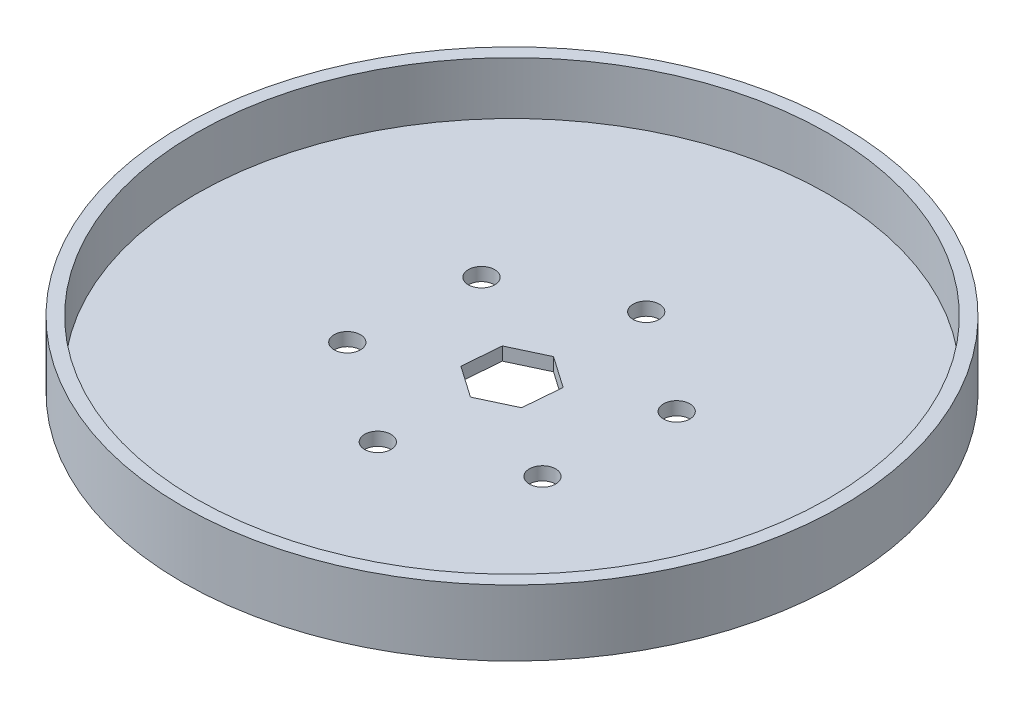
ISO-10303-21;
HEADER;
FILE_DESCRIPTION(('STEP AP214'),'2;1');
FILE_NAME('part.step','',(''),(''),'','','');
FILE_SCHEMA(('AUTOMOTIVE_DESIGN { 1 0 10303 214 1 1 1 1 }'));
ENDSEC;
DATA;
#1=APPLICATION_CONTEXT('core data for automotive mechanical design processes');
#2=APPLICATION_PROTOCOL_DEFINITION('international standard','automotive_design',2000,#1);
#3=PRODUCT_CONTEXT('',#1,'mechanical');
#4=PRODUCT('Part','Part','',(#3));
#5=PRODUCT_RELATED_PRODUCT_CATEGORY('part','',(#4));
#6=PRODUCT_DEFINITION_FORMATION('','',#4);
#7=PRODUCT_DEFINITION_CONTEXT('part definition',#1,'design');
#8=PRODUCT_DEFINITION('design','',#6,#7);
#9=PRODUCT_DEFINITION_SHAPE('','',#8);
#10=(LENGTH_UNIT() NAMED_UNIT(*) SI_UNIT(.MILLI.,.METRE.));
#11=(NAMED_UNIT(*) PLANE_ANGLE_UNIT() SI_UNIT($,.RADIAN.));
#12=(NAMED_UNIT(*) SI_UNIT($,.STERADIAN.) SOLID_ANGLE_UNIT());
#13=UNCERTAINTY_MEASURE_WITH_UNIT(LENGTH_MEASURE(1.E-05),#10,'distance_accuracy_value','');
#14=(GEOMETRIC_REPRESENTATION_CONTEXT(3) GLOBAL_UNCERTAINTY_ASSIGNED_CONTEXT((#13)) GLOBAL_UNIT_ASSIGNED_CONTEXT((#10,
#11,#12)) REPRESENTATION_CONTEXT('',''));
#15=CARTESIAN_POINT('',(0.,0.,0.));
#16=DIRECTION('',(0.,0.,1.));
#17=DIRECTION('',(1.,0.,0.));
#18=AXIS2_PLACEMENT_3D('',#15,#16,#17);
#19=CARTESIAN_POINT('',(0.,-12.7,0.));
#20=DIRECTION('',(0.,1.,0.));
#21=DIRECTION('',(0.,0.,1.));
#22=AXIS2_PLACEMENT_3D('',#19,#20,#21);
#23=CYLINDRICAL_SURFACE('',#22,63.5);
#24=CARTESIAN_POINT('',(0.,-12.7,0.));
#25=DIRECTION('',(0.,1.,0.));
#26=DIRECTION('',(0.,0.,1.));
#27=AXIS2_PLACEMENT_3D('',#24,#25,#26);
#28=CIRCLE('',#27,63.5);
#29=CARTESIAN_POINT('',(0.,-12.7,63.5));
#30=VERTEX_POINT('',#29);
#31=EDGE_CURVE('E11',#30,#30,#28,.T.);
#32=ORIENTED_EDGE('',*,*,#31,.T.);
#33=EDGE_LOOP('',(#32));
#34=FACE_BOUND('',#33,.T.);
#35=CARTESIAN_POINT('',(0.,0.,0.));
#36=DIRECTION('',(0.,1.,0.));
#37=DIRECTION('',(0.,0.,1.));
#38=AXIS2_PLACEMENT_3D('',#35,#36,#37);
#39=CIRCLE('',#38,63.5);
#40=CARTESIAN_POINT('',(0.,0.,63.5));
#41=VERTEX_POINT('',#40);
#42=EDGE_CURVE('E42',#41,#41,#39,.T.);
#43=ORIENTED_EDGE('',*,*,#42,.F.);
#44=EDGE_LOOP('',(#43));
#45=FACE_BOUND('',#44,.T.);
#46=ADVANCED_FACE('F39',(#34,#45),#23,.T.);
#47=CARTESIAN_POINT('',(0.,-12.7,0.));
#48=DIRECTION('',(0.,1.,0.));
#49=DIRECTION('',(0.,0.,1.));
#50=AXIS2_PLACEMENT_3D('',#47,#48,#49);
#51=PLANE('',#50);
#52=DIRECTION('',(-0.905001604638414,0.,0.4254081517812));
#53=VECTOR('',#52,1.);
#54=CARTESIAN_POINT('',(0.622717296324225,-12.7,-7.3794443898028));
#55=LINE('',#54,#53);
#56=CARTESIAN_POINT('',(0.622717296324225,-12.7,-7.3794443898028));
#57=VERTEX_POINT('',#56);
#58=CARTESIAN_POINT('',(-6.07942765922167,-12.7,-4.22901119289414));
#59=VERTEX_POINT('',#58);
#60=EDGE_CURVE('E117',#57,#59,#55,.T.);
#61=ORIENTED_EDGE('',*,*,#60,.T.);
#62=DIRECTION('',(-0.0840865358997016,0.,0.996458455973147));
#63=VECTOR('',#62,1.);
#64=CARTESIAN_POINT('',(-6.07942765922167,-12.7,-4.22901119289414));
#65=LINE('',#64,#63);
#66=CARTESIAN_POINT('',(-6.70214495554589,-12.7,3.15043319690866));
#67=VERTEX_POINT('',#66);
#68=EDGE_CURVE('E248',#59,#67,#65,.T.);
#69=ORIENTED_EDGE('',*,*,#68,.T.);
#70=DIRECTION('',(0.820915068738712,0.,0.571050304191948));
#71=VECTOR('',#70,1.);
#72=CARTESIAN_POINT('',(-6.70214495554589,-12.7,3.15043319690866));
#73=LINE('',#72,#71);
#74=CARTESIAN_POINT('',(-0.622717296324223,-12.7,7.3794443898028));
#75=VERTEX_POINT('',#74);
#76=EDGE_CURVE('E284',#67,#75,#73,.T.);
#77=ORIENTED_EDGE('',*,*,#76,.T.);
#78=DIRECTION('',(0.905001604638414,0.,-0.4254081517812));
#79=VECTOR('',#78,1.);
#80=CARTESIAN_POINT('',(-0.622717296324223,-12.7,7.3794443898028));
#81=LINE('',#80,#79);
#82=CARTESIAN_POINT('',(6.07942765922167,-12.7,4.22901119289414));
#83=VERTEX_POINT('',#82);
#84=EDGE_CURVE('E62',#75,#83,#81,.T.);
#85=ORIENTED_EDGE('',*,*,#84,.T.);
#86=DIRECTION('',(0.0840865358997015,0.,-0.996458455973147));
#87=VECTOR('',#86,1.);
#88=CARTESIAN_POINT('',(6.07942765922167,-12.7,4.22901119289414));
#89=LINE('',#88,#87);
#90=CARTESIAN_POINT('',(6.70214495554589,-12.7,-3.15043319690866));
#91=VERTEX_POINT('',#90);
#92=EDGE_CURVE('E290',#83,#91,#89,.T.);
#93=ORIENTED_EDGE('',*,*,#92,.T.);
#94=DIRECTION('',(-0.820915068738712,0.,-0.571050304191948));
#95=VECTOR('',#94,1.);
#96=CARTESIAN_POINT('',(6.70214495554589,-12.7,-3.15043319690866));
#97=LINE('',#96,#95);
#98=EDGE_CURVE('E294',#91,#57,#97,.T.);
#99=ORIENTED_EDGE('',*,*,#98,.T.);
#100=EDGE_LOOP('',(#61,#69,#77,#85,#93,#99));
#101=FACE_BOUND('',#100,.T.);
#102=CARTESIAN_POINT('',(-2.0723522882915,-12.7,23.7858935504474));
#103=DIRECTION('',(0.,1.,0.));
#104=DIRECTION('',(0.,0.,1.));
#105=AXIS2_PLACEMENT_3D('',#102,#103,#104);
#106=CIRCLE('',#105,2.54);
#107=CARTESIAN_POINT('',(-2.0723522882915,-12.7,26.3258935504474));
#108=VERTEX_POINT('',#107);
#109=EDGE_CURVE('E124',#108,#108,#106,.T.);
#110=ORIENTED_EDGE('',*,*,#109,.T.);
#111=EDGE_LOOP('',(#110));
#112=FACE_BOUND('',#111,.T.);
#113=CARTESIAN_POINT('',(19.5630119222539,-12.7,13.6876565024752));
#114=DIRECTION('',(0.,1.,0.));
#115=DIRECTION('',(0.,0.,1.));
#116=AXIS2_PLACEMENT_3D('',#113,#114,#115);
#117=CIRCLE('',#116,2.54000000000001);
#118=CARTESIAN_POINT('',(19.5630119222539,-12.7,16.2276565024752));
#119=VERTEX_POINT('',#118);
#120=EDGE_CURVE('E153',#119,#119,#117,.T.);
#121=ORIENTED_EDGE('',*,*,#120,.T.);
#122=EDGE_LOOP('',(#121));
#123=FACE_BOUND('',#122,.T.);
#124=CARTESIAN_POINT('',(-21.6353642105456,-12.7,10.0982370479724));
#125=DIRECTION('',(0.,1.,0.));
#126=DIRECTION('',(0.,0.,1.));
#127=AXIS2_PLACEMENT_3D('',#124,#125,#126);
#128=CIRCLE('',#127,2.54000000000001);
#129=CARTESIAN_POINT('',(-21.6353642105456,-12.7,12.6382370479724));
#130=VERTEX_POINT('',#129);
#131=EDGE_CURVE('E149',#130,#130,#128,.T.);
#132=ORIENTED_EDGE('',*,*,#131,.T.);
#133=EDGE_LOOP('',(#132));
#134=FACE_BOUND('',#133,.T.);
#135=CARTESIAN_POINT('',(-19.563011922254,-12.7,-13.687656502475));
#136=DIRECTION('',(0.,1.,0.));
#137=DIRECTION('',(0.,0.,1.));
#138=AXIS2_PLACEMENT_3D('',#135,#136,#137);
#139=CIRCLE('',#138,2.54);
#140=CARTESIAN_POINT('',(-19.563011922254,-12.7,-11.147656502475));
#141=VERTEX_POINT('',#140);
#142=EDGE_CURVE('E145',#141,#141,#139,.T.);
#143=ORIENTED_EDGE('',*,*,#142,.T.);
#144=EDGE_LOOP('',(#143));
#145=FACE_BOUND('',#144,.T.);
#146=CARTESIAN_POINT('',(2.07235228829167,-12.7,-23.7858935504473));
#147=DIRECTION('',(0.,1.,0.));
#148=DIRECTION('',(0.,0.,1.));
#149=AXIS2_PLACEMENT_3D('',#146,#147,#148);
#150=CIRCLE('',#149,2.54000000000001);
#151=CARTESIAN_POINT('',(2.07235228829167,-12.7,-21.2458935504473));
#152=VERTEX_POINT('',#151);
#153=EDGE_CURVE('E140',#152,#152,#150,.T.);
#154=ORIENTED_EDGE('',*,*,#153,.T.);
#155=EDGE_LOOP('',(#154));
#156=FACE_BOUND('',#155,.T.);
#157=CARTESIAN_POINT('',(21.6353642105457,-12.7,-10.0982370479722));
#158=DIRECTION('',(0.,1.,0.));
#159=DIRECTION('',(0.,0.,1.));
#160=AXIS2_PLACEMENT_3D('',#157,#158,#159);
#161=CIRCLE('',#160,2.54000000000001);
#162=CARTESIAN_POINT('',(21.6353642105457,-12.7,-7.55823704797221));
#163=VERTEX_POINT('',#162);
#164=EDGE_CURVE('E144',#163,#163,#161,.T.);
#165=ORIENTED_EDGE('',*,*,#164,.T.);
#166=EDGE_LOOP('',(#165));
#167=FACE_BOUND('',#166,.T.);
#168=ORIENTED_EDGE('',*,*,#31,.F.);
#169=EDGE_LOOP('',(#168));
#170=FACE_BOUND('',#169,.T.);
#171=ADVANCED_FACE('F171',(#101,#112,#123,#134,#145,#156,#167,#170),#51,.F.);
#172=CARTESIAN_POINT('',(0.,0.,0.));
#173=DIRECTION('',(0.,1.,0.));
#174=DIRECTION('',(0.,0.,1.));
#175=AXIS2_PLACEMENT_3D('',#172,#173,#174);
#176=PLANE('',#175);
#177=CARTESIAN_POINT('',(0.,0.,0.));
#178=DIRECTION('',(0.,1.,0.));
#179=DIRECTION('',(0.,0.,1.));
#180=AXIS2_PLACEMENT_3D('',#177,#178,#179);
#181=CIRCLE('',#180,60.96);
#182=CARTESIAN_POINT('',(0.,0.,60.96));
#183=VERTEX_POINT('',#182);
#184=EDGE_CURVE('E242',#183,#183,#181,.T.);
#185=ORIENTED_EDGE('',*,*,#184,.F.);
#186=EDGE_LOOP('',(#185));
#187=FACE_BOUND('',#186,.T.);
#188=ORIENTED_EDGE('',*,*,#42,.T.);
#189=EDGE_LOOP('',(#188));
#190=FACE_BOUND('',#189,.T.);
#191=ADVANCED_FACE('F168',(#187,#190),#176,.T.);
#192=CARTESIAN_POINT('',(21.6353642105457,-12.7,-10.0982370479722));
#193=DIRECTION('',(0.,1.,0.));
#194=DIRECTION('',(0.,0.,1.));
#195=AXIS2_PLACEMENT_3D('',#192,#193,#194);
#196=CYLINDRICAL_SURFACE('',#195,2.54000000000001);
#197=CARTESIAN_POINT('',(21.6353642105457,-10.16,-10.0982370479722));
#198=DIRECTION('',(0.,1.,0.));
#199=DIRECTION('',(0.,0.,1.));
#200=AXIS2_PLACEMENT_3D('',#197,#198,#199);
#201=CIRCLE('',#200,2.54000000000001);
#202=CARTESIAN_POINT('',(21.6353642105457,-10.16,-7.55823704797221));
#203=VERTEX_POINT('',#202);
#204=EDGE_CURVE('E244',#203,#203,#201,.T.);
#205=ORIENTED_EDGE('',*,*,#204,.T.);
#206=EDGE_LOOP('',(#205));
#207=FACE_BOUND('',#206,.T.);
#208=ORIENTED_EDGE('',*,*,#164,.F.);
#209=EDGE_LOOP('',(#208));
#210=FACE_BOUND('',#209,.T.);
#211=ADVANCED_FACE('F183',(#207,#210),#196,.F.);
#212=CARTESIAN_POINT('',(2.07235228829167,-12.7,-23.7858935504473));
#213=DIRECTION('',(0.,1.,0.));
#214=DIRECTION('',(0.,0.,1.));
#215=AXIS2_PLACEMENT_3D('',#212,#213,#214);
#216=CYLINDRICAL_SURFACE('',#215,2.54000000000001);
#217=CARTESIAN_POINT('',(2.07235228829167,-10.16,-23.7858935504473));
#218=DIRECTION('',(0.,1.,0.));
#219=DIRECTION('',(0.,0.,1.));
#220=AXIS2_PLACEMENT_3D('',#217,#218,#219);
#221=CIRCLE('',#220,2.54000000000001);
#222=CARTESIAN_POINT('',(2.07235228829167,-10.16,-21.2458935504473));
#223=VERTEX_POINT('',#222);
#224=EDGE_CURVE('E251',#223,#223,#221,.T.);
#225=ORIENTED_EDGE('',*,*,#224,.T.);
#226=EDGE_LOOP('',(#225));
#227=FACE_BOUND('',#226,.T.);
#228=ORIENTED_EDGE('',*,*,#153,.F.);
#229=EDGE_LOOP('',(#228));
#230=FACE_BOUND('',#229,.T.);
#231=ADVANCED_FACE('F189',(#227,#230),#216,.F.);
#232=CARTESIAN_POINT('',(-19.563011922254,-12.7,-13.687656502475));
#233=DIRECTION('',(0.,1.,0.));
#234=DIRECTION('',(0.,0.,1.));
#235=AXIS2_PLACEMENT_3D('',#232,#233,#234);
#236=CYLINDRICAL_SURFACE('',#235,2.54);
#237=CARTESIAN_POINT('',(-19.563011922254,-10.16,-13.687656502475));
#238=DIRECTION('',(0.,1.,0.));
#239=DIRECTION('',(0.,0.,1.));
#240=AXIS2_PLACEMENT_3D('',#237,#238,#239);
#241=CIRCLE('',#240,2.54);
#242=CARTESIAN_POINT('',(-19.563011922254,-10.16,-11.147656502475));
#243=VERTEX_POINT('',#242);
#244=EDGE_CURVE('E274',#243,#243,#241,.T.);
#245=ORIENTED_EDGE('',*,*,#244,.T.);
#246=EDGE_LOOP('',(#245));
#247=FACE_BOUND('',#246,.T.);
#248=ORIENTED_EDGE('',*,*,#142,.F.);
#249=EDGE_LOOP('',(#248));
#250=FACE_BOUND('',#249,.T.);
#251=ADVANCED_FACE('F203',(#247,#250),#236,.F.);
#252=CARTESIAN_POINT('',(-21.6353642105456,-12.7,10.0982370479724));
#253=DIRECTION('',(0.,1.,0.));
#254=DIRECTION('',(0.,0.,1.));
#255=AXIS2_PLACEMENT_3D('',#252,#253,#254);
#256=CYLINDRICAL_SURFACE('',#255,2.54000000000001);
#257=CARTESIAN_POINT('',(-21.6353642105456,-10.16,10.0982370479724));
#258=DIRECTION('',(0.,1.,0.));
#259=DIRECTION('',(0.,0.,1.));
#260=AXIS2_PLACEMENT_3D('',#257,#258,#259);
#261=CIRCLE('',#260,2.54000000000001);
#262=CARTESIAN_POINT('',(-21.6353642105456,-10.16,12.6382370479724));
#263=VERTEX_POINT('',#262);
#264=EDGE_CURVE('E270',#263,#263,#261,.T.);
#265=ORIENTED_EDGE('',*,*,#264,.T.);
#266=EDGE_LOOP('',(#265));
#267=FACE_BOUND('',#266,.T.);
#268=ORIENTED_EDGE('',*,*,#131,.F.);
#269=EDGE_LOOP('',(#268));
#270=FACE_BOUND('',#269,.T.);
#271=ADVANCED_FACE('F199',(#267,#270),#256,.F.);
#272=CARTESIAN_POINT('',(19.5630119222539,-12.7,13.6876565024752));
#273=DIRECTION('',(0.,1.,0.));
#274=DIRECTION('',(0.,0.,1.));
#275=AXIS2_PLACEMENT_3D('',#272,#273,#274);
#276=CYLINDRICAL_SURFACE('',#275,2.54000000000001);
#277=CARTESIAN_POINT('',(19.5630119222539,-10.16,13.6876565024752));
#278=DIRECTION('',(0.,1.,0.));
#279=DIRECTION('',(0.,0.,1.));
#280=AXIS2_PLACEMENT_3D('',#277,#278,#279);
#281=CIRCLE('',#280,2.54000000000001);
#282=CARTESIAN_POINT('',(19.5630119222539,-10.16,16.2276565024752));
#283=VERTEX_POINT('',#282);
#284=EDGE_CURVE('E266',#283,#283,#281,.T.);
#285=ORIENTED_EDGE('',*,*,#284,.T.);
#286=EDGE_LOOP('',(#285));
#287=FACE_BOUND('',#286,.T.);
#288=ORIENTED_EDGE('',*,*,#120,.F.);
#289=EDGE_LOOP('',(#288));
#290=FACE_BOUND('',#289,.T.);
#291=ADVANCED_FACE('F195',(#287,#290),#276,.F.);
#292=CARTESIAN_POINT('',(-2.0723522882915,-12.7,23.7858935504474));
#293=DIRECTION('',(0.,1.,0.));
#294=DIRECTION('',(0.,0.,1.));
#295=AXIS2_PLACEMENT_3D('',#292,#293,#294);
#296=CYLINDRICAL_SURFACE('',#295,2.54);
#297=CARTESIAN_POINT('',(-2.0723522882915,-10.16,23.7858935504474));
#298=DIRECTION('',(0.,1.,0.));
#299=DIRECTION('',(0.,0.,1.));
#300=AXIS2_PLACEMENT_3D('',#297,#298,#299);
#301=CIRCLE('',#300,2.54);
#302=CARTESIAN_POINT('',(-2.0723522882915,-10.16,26.3258935504474));
#303=VERTEX_POINT('',#302);
#304=EDGE_CURVE('E103',#303,#303,#301,.T.);
#305=ORIENTED_EDGE('',*,*,#304,.T.);
#306=EDGE_LOOP('',(#305));
#307=FACE_BOUND('',#306,.T.);
#308=ORIENTED_EDGE('',*,*,#109,.F.);
#309=EDGE_LOOP('',(#308));
#310=FACE_BOUND('',#309,.T.);
#311=ADVANCED_FACE('F191',(#307,#310),#296,.F.);
#312=CARTESIAN_POINT('',(-6.07942765922167,-12.7,-4.22901119289414));
#313=DIRECTION('',(-0.996458455973147,0.,-0.0840865358997016));
#314=DIRECTION('',(-0.0840865358997017,0.,0.996458455973147));
#315=AXIS2_PLACEMENT_3D('',#312,#313,#314);
#316=PLANE('',#315);
#317=DIRECTION('',(0.,1.,0.));
#318=VECTOR('',#317,1.);
#319=CARTESIAN_POINT('',(-6.07942765922167,-12.7,-4.22901119289414));
#320=LINE('',#319,#318);
#321=CARTESIAN_POINT('',(-6.07942765922167,-10.16,-4.22901119289414));
#322=VERTEX_POINT('',#321);
#323=EDGE_CURVE('E120',#59,#322,#320,.T.);
#324=ORIENTED_EDGE('',*,*,#323,.T.);
#325=DIRECTION('',(-0.0840865358997017,0.,0.996458455973147));
#326=VECTOR('',#325,1.);
#327=CARTESIAN_POINT('',(-6.39078630738378,-10.16,-0.539288997992736));
#328=LINE('',#327,#326);
#329=CARTESIAN_POINT('',(-6.70214495554589,-10.16,3.15043319690866));
#330=VERTEX_POINT('',#329);
#331=EDGE_CURVE('E98',#322,#330,#328,.T.);
#332=ORIENTED_EDGE('',*,*,#331,.T.);
#333=DIRECTION('',(0.,1.,0.));
#334=VECTOR('',#333,1.);
#335=CARTESIAN_POINT('',(-6.70214495554589,-12.7,3.15043319690866));
#336=LINE('',#335,#334);
#337=EDGE_CURVE('E136',#67,#330,#336,.T.);
#338=ORIENTED_EDGE('',*,*,#337,.F.);
#339=ORIENTED_EDGE('',*,*,#68,.F.);
#340=EDGE_LOOP('',(#324,#332,#338,#339));
#341=FACE_BOUND('',#340,.T.);
#342=ADVANCED_FACE('F194',(#341),#316,.F.);
#343=CARTESIAN_POINT('',(0.622717296324225,-12.7,-7.3794443898028));
#344=DIRECTION('',(-0.4254081517812,0.,-0.905001604638414));
#345=DIRECTION('',(-0.905001604638414,0.,0.4254081517812));
#346=AXIS2_PLACEMENT_3D('',#343,#344,#345);
#347=PLANE('',#346);
#348=DIRECTION('',(0.,1.,0.));
#349=VECTOR('',#348,1.);
#350=CARTESIAN_POINT('',(0.622717296324225,-12.7,-7.3794443898028));
#351=LINE('',#350,#349);
#352=CARTESIAN_POINT('',(0.622717296324225,-10.16,-7.3794443898028));
#353=VERTEX_POINT('',#352);
#354=EDGE_CURVE('E109',#57,#353,#351,.T.);
#355=ORIENTED_EDGE('',*,*,#354,.T.);
#356=DIRECTION('',(-0.905001604638414,0.,0.4254081517812));
#357=VECTOR('',#356,1.);
#358=CARTESIAN_POINT('',(-2.72835518144872,-10.16,-5.80422779134847));
#359=LINE('',#358,#357);
#360=EDGE_CURVE('E91',#353,#322,#359,.T.);
#361=ORIENTED_EDGE('',*,*,#360,.T.);
#362=ORIENTED_EDGE('',*,*,#323,.F.);
#363=ORIENTED_EDGE('',*,*,#60,.F.);
#364=EDGE_LOOP('',(#355,#361,#362,#363));
#365=FACE_BOUND('',#364,.T.);
#366=ADVANCED_FACE('F115',(#365),#347,.F.);
#367=CARTESIAN_POINT('',(6.70214495554589,-12.7,-3.15043319690866));
#368=DIRECTION('',(0.571050304191948,0.,-0.820915068738712));
#369=DIRECTION('',(-0.820915068738712,0.,-0.571050304191948));
#370=AXIS2_PLACEMENT_3D('',#367,#368,#369);
#371=PLANE('',#370);
#372=DIRECTION('',(0.,1.,0.));
#373=VECTOR('',#372,1.);
#374=CARTESIAN_POINT('',(6.70214495554589,-12.7,-3.15043319690866));
#375=LINE('',#374,#373);
#376=CARTESIAN_POINT('',(6.70214495554589,-10.16,-3.15043319690866));
#377=VERTEX_POINT('',#376);
#378=EDGE_CURVE('E111',#91,#377,#375,.T.);
#379=ORIENTED_EDGE('',*,*,#378,.T.);
#380=DIRECTION('',(-0.820915068738712,0.,-0.571050304191948));
#381=VECTOR('',#380,1.);
#382=CARTESIAN_POINT('',(3.66243112593506,-10.16,-5.26493879335573));
#383=LINE('',#382,#381);
#384=EDGE_CURVE('E95',#377,#353,#383,.T.);
#385=ORIENTED_EDGE('',*,*,#384,.T.);
#386=ORIENTED_EDGE('',*,*,#354,.F.);
#387=ORIENTED_EDGE('',*,*,#98,.F.);
#388=EDGE_LOOP('',(#379,#385,#386,#387));
#389=FACE_BOUND('',#388,.T.);
#390=ADVANCED_FACE('F107',(#389),#371,.F.);
#391=CARTESIAN_POINT('',(6.07942765922167,-12.7,4.22901119289414));
#392=DIRECTION('',(0.996458455973147,0.,0.0840865358997015));
#393=DIRECTION('',(0.0840865358997015,0.,-0.996458455973147));
#394=AXIS2_PLACEMENT_3D('',#391,#392,#393);
#395=PLANE('',#394);
#396=DIRECTION('',(0.,1.,0.));
#397=VECTOR('',#396,1.);
#398=CARTESIAN_POINT('',(6.07942765922167,-12.7,4.22901119289414));
#399=LINE('',#398,#397);
#400=CARTESIAN_POINT('',(6.07942765922167,-10.16,4.22901119289414));
#401=VERTEX_POINT('',#400);
#402=EDGE_CURVE('E126',#83,#401,#399,.T.);
#403=ORIENTED_EDGE('',*,*,#402,.T.);
#404=DIRECTION('',(0.0840865358997015,0.,-0.996458455973147));
#405=VECTOR('',#404,1.);
#406=CARTESIAN_POINT('',(6.39078630738378,-10.16,0.539288997992735));
#407=LINE('',#406,#405);
#408=EDGE_CURVE('E113',#401,#377,#407,.T.);
#409=ORIENTED_EDGE('',*,*,#408,.T.);
#410=ORIENTED_EDGE('',*,*,#378,.F.);
#411=ORIENTED_EDGE('',*,*,#92,.F.);
#412=EDGE_LOOP('',(#403,#409,#410,#411));
#413=FACE_BOUND('',#412,.T.);
#414=ADVANCED_FACE('F222',(#413),#395,.F.);
#415=CARTESIAN_POINT('',(-0.622717296324223,-12.7,7.3794443898028));
#416=DIRECTION('',(0.4254081517812,0.,0.905001604638414));
#417=DIRECTION('',(0.905001604638414,0.,-0.4254081517812));
#418=AXIS2_PLACEMENT_3D('',#415,#416,#417);
#419=PLANE('',#418);
#420=DIRECTION('',(0.,1.,0.));
#421=VECTOR('',#420,1.);
#422=CARTESIAN_POINT('',(-0.622717296324223,-12.7,7.3794443898028));
#423=LINE('',#422,#421);
#424=CARTESIAN_POINT('',(-0.622717296324223,-10.16,7.3794443898028));
#425=VERTEX_POINT('',#424);
#426=EDGE_CURVE('E133',#75,#425,#423,.T.);
#427=ORIENTED_EDGE('',*,*,#426,.T.);
#428=DIRECTION('',(0.905001604638414,0.,-0.4254081517812));
#429=VECTOR('',#428,1.);
#430=CARTESIAN_POINT('',(2.72835518144872,-10.16,5.80422779134847));
#431=LINE('',#430,#429);
#432=EDGE_CURVE('E54',#425,#401,#431,.T.);
#433=ORIENTED_EDGE('',*,*,#432,.T.);
#434=ORIENTED_EDGE('',*,*,#402,.F.);
#435=ORIENTED_EDGE('',*,*,#84,.F.);
#436=EDGE_LOOP('',(#427,#433,#434,#435));
#437=FACE_BOUND('',#436,.T.);
#438=ADVANCED_FACE('F218',(#437),#419,.F.);
#439=CARTESIAN_POINT('',(-6.70214495554589,-12.7,3.15043319690866));
#440=DIRECTION('',(-0.571050304191948,0.,0.820915068738712));
#441=DIRECTION('',(0.820915068738712,0.,0.571050304191948));
#442=AXIS2_PLACEMENT_3D('',#439,#440,#441);
#443=PLANE('',#442);
#444=ORIENTED_EDGE('',*,*,#337,.T.);
#445=DIRECTION('',(0.820915068738712,0.,0.571050304191948));
#446=VECTOR('',#445,1.);
#447=CARTESIAN_POINT('',(-3.66243112593506,-10.16,5.26493879335573));
#448=LINE('',#447,#446);
#449=EDGE_CURVE('E258',#330,#425,#448,.T.);
#450=ORIENTED_EDGE('',*,*,#449,.T.);
#451=ORIENTED_EDGE('',*,*,#426,.F.);
#452=ORIENTED_EDGE('',*,*,#76,.F.);
#453=EDGE_LOOP('',(#444,#450,#451,#452));
#454=FACE_BOUND('',#453,.T.);
#455=ADVANCED_FACE('F214',(#454),#443,.F.);
#456=CARTESIAN_POINT('',(0.,-12.7,0.));
#457=DIRECTION('',(0.,1.,0.));
#458=DIRECTION('',(0.,0.,1.));
#459=AXIS2_PLACEMENT_3D('',#456,#457,#458);
#460=CYLINDRICAL_SURFACE('',#459,60.96);
#461=CARTESIAN_POINT('',(0.,-10.16,0.));
#462=DIRECTION('',(0.,1.,0.));
#463=DIRECTION('',(0.,0.,1.));
#464=AXIS2_PLACEMENT_3D('',#461,#462,#463);
#465=CIRCLE('',#464,60.96);
#466=CARTESIAN_POINT('',(0.,-10.16,60.96));
#467=VERTEX_POINT('',#466);
#468=EDGE_CURVE('E239',#467,#467,#465,.T.);
#469=ORIENTED_EDGE('',*,*,#468,.F.);
#470=EDGE_LOOP('',(#469));
#471=FACE_BOUND('',#470,.T.);
#472=ORIENTED_EDGE('',*,*,#184,.T.);
#473=EDGE_LOOP('',(#472));
#474=FACE_BOUND('',#473,.T.);
#475=ADVANCED_FACE('F217',(#471,#474),#460,.F.);
#476=CARTESIAN_POINT('',(0.,-10.16,0.));
#477=DIRECTION('',(0.,1.,0.));
#478=DIRECTION('',(0.,0.,1.));
#479=AXIS2_PLACEMENT_3D('',#476,#477,#478);
#480=PLANE('',#479);
#481=ORIENTED_EDGE('',*,*,#360,.F.);
#482=ORIENTED_EDGE('',*,*,#384,.F.);
#483=ORIENTED_EDGE('',*,*,#408,.F.);
#484=ORIENTED_EDGE('',*,*,#432,.F.);
#485=ORIENTED_EDGE('',*,*,#449,.F.);
#486=ORIENTED_EDGE('',*,*,#331,.F.);
#487=EDGE_LOOP('',(#481,#482,#483,#484,#485,#486));
#488=FACE_BOUND('',#487,.T.);
#489=ORIENTED_EDGE('',*,*,#304,.F.);
#490=EDGE_LOOP('',(#489));
#491=FACE_BOUND('',#490,.T.);
#492=ORIENTED_EDGE('',*,*,#284,.F.);
#493=EDGE_LOOP('',(#492));
#494=FACE_BOUND('',#493,.T.);
#495=ORIENTED_EDGE('',*,*,#264,.F.);
#496=EDGE_LOOP('',(#495));
#497=FACE_BOUND('',#496,.T.);
#498=ORIENTED_EDGE('',*,*,#244,.F.);
#499=EDGE_LOOP('',(#498));
#500=FACE_BOUND('',#499,.T.);
#501=ORIENTED_EDGE('',*,*,#224,.F.);
#502=EDGE_LOOP('',(#501));
#503=FACE_BOUND('',#502,.T.);
#504=ORIENTED_EDGE('',*,*,#204,.F.);
#505=EDGE_LOOP('',(#504));
#506=FACE_BOUND('',#505,.T.);
#507=ORIENTED_EDGE('',*,*,#468,.T.);
#508=EDGE_LOOP('',(#507));
#509=FACE_BOUND('',#508,.T.);
#510=ADVANCED_FACE('F93',(#488,#491,#494,#497,#500,#503,#506,#509),#480,.T.);
#511=CLOSED_SHELL('',(#46,#171,#191,#211,#231,#251,#271,#291,#311,#342,#366,#390,#414,#438,#455,
#475,#510));
#512=MANIFOLD_SOLID_BREP('B2',#511);
#513=ADVANCED_BREP_SHAPE_REPRESENTATION('',(#18,#512),#14);
#514=SHAPE_DEFINITION_REPRESENTATION(#9,#513);
ENDSEC;
END-ISO-10303-21;
